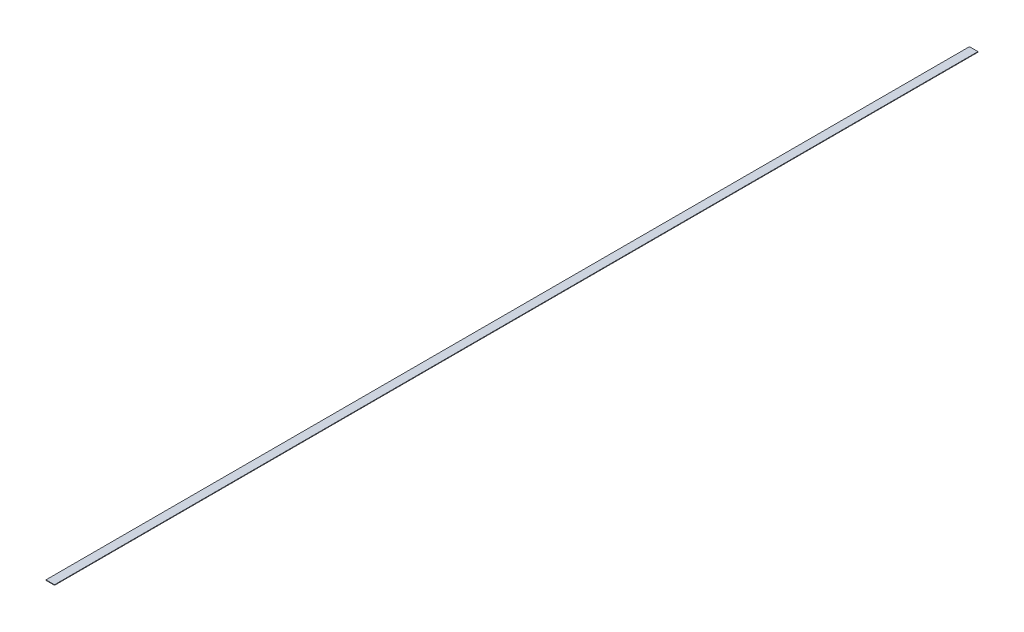
ISO-10303-21;
HEADER;
FILE_DESCRIPTION(('STEP AP214'),'2;1');
FILE_NAME('part.step','',(''),(''),'','','');
FILE_SCHEMA(('AUTOMOTIVE_DESIGN { 1 0 10303 214 1 1 1 1 }'));
ENDSEC;
DATA;
#1=APPLICATION_CONTEXT('core data for automotive mechanical design processes');
#2=APPLICATION_PROTOCOL_DEFINITION('international standard','automotive_design',2000,#1);
#3=PRODUCT_CONTEXT('',#1,'mechanical');
#4=PRODUCT('Part','Part','',(#3));
#5=PRODUCT_RELATED_PRODUCT_CATEGORY('part','',(#4));
#6=PRODUCT_DEFINITION_FORMATION('','',#4);
#7=PRODUCT_DEFINITION_CONTEXT('part definition',#1,'design');
#8=PRODUCT_DEFINITION('design','',#6,#7);
#9=PRODUCT_DEFINITION_SHAPE('','',#8);
#10=(LENGTH_UNIT() NAMED_UNIT(*) SI_UNIT(.MILLI.,.METRE.));
#11=(NAMED_UNIT(*) PLANE_ANGLE_UNIT() SI_UNIT($,.RADIAN.));
#12=(NAMED_UNIT(*) SI_UNIT($,.STERADIAN.) SOLID_ANGLE_UNIT());
#13=UNCERTAINTY_MEASURE_WITH_UNIT(LENGTH_MEASURE(1.E-05),#10,'distance_accuracy_value','');
#14=(GEOMETRIC_REPRESENTATION_CONTEXT(3) GLOBAL_UNCERTAINTY_ASSIGNED_CONTEXT((#13)) GLOBAL_UNIT_ASSIGNED_CONTEXT((#10,
#11,#12)) REPRESENTATION_CONTEXT('',''));
#15=CARTESIAN_POINT('',(0.,0.,0.));
#16=DIRECTION('',(0.,0.,1.));
#17=DIRECTION('',(1.,0.,0.));
#18=AXIS2_PLACEMENT_3D('',#15,#16,#17);
#19=CARTESIAN_POINT('',(25.4,3.175,2746.375));
#20=DIRECTION('',(-1.,0.,0.));
#21=DIRECTION('',(0.,0.,1.));
#22=AXIS2_PLACEMENT_3D('',#19,#20,#21);
#23=PLANE('',#22);
#24=DIRECTION('',(0.,0.,-1.));
#25=VECTOR('',#24,1.);
#26=CARTESIAN_POINT('',(25.4,0.,2746.375));
#27=LINE('',#26,#25);
#28=CARTESIAN_POINT('',(25.4,0.,2746.375));
#29=VERTEX_POINT('',#28);
#30=CARTESIAN_POINT('',(25.4,0.,-2746.375));
#31=VERTEX_POINT('',#30);
#32=EDGE_CURVE('E96',#29,#31,#27,.T.);
#33=ORIENTED_EDGE('',*,*,#32,.T.);
#34=DIRECTION('',(0.,-1.,0.));
#35=VECTOR('',#34,1.);
#36=CARTESIAN_POINT('',(25.4,3.175,-2746.375));
#37=LINE('',#36,#35);
#38=CARTESIAN_POINT('',(25.4,3.175,-2746.375));
#39=VERTEX_POINT('',#38);
#40=EDGE_CURVE('E11',#39,#31,#37,.T.);
#41=ORIENTED_EDGE('',*,*,#40,.F.);
#42=DIRECTION('',(0.,0.,-1.));
#43=VECTOR('',#42,1.);
#44=CARTESIAN_POINT('',(25.4,3.175,2746.375));
#45=LINE('',#44,#43);
#46=CARTESIAN_POINT('',(25.4,3.175,2746.375));
#47=VERTEX_POINT('',#46);
#48=EDGE_CURVE('E84',#47,#39,#45,.T.);
#49=ORIENTED_EDGE('',*,*,#48,.F.);
#50=DIRECTION('',(0.,-1.,0.));
#51=VECTOR('',#50,1.);
#52=CARTESIAN_POINT('',(25.4,3.175,2746.375));
#53=LINE('',#52,#51);
#54=EDGE_CURVE('E92',#47,#29,#53,.T.);
#55=ORIENTED_EDGE('',*,*,#54,.T.);
#56=EDGE_LOOP('',(#33,#41,#49,#55));
#57=FACE_BOUND('',#56,.T.);
#58=ADVANCED_FACE('F33',(#57),#23,.F.);
#59=CARTESIAN_POINT('',(-25.4,3.175,-2746.375));
#60=DIRECTION('',(0.,0.,1.));
#61=DIRECTION('',(1.,0.,0.));
#62=AXIS2_PLACEMENT_3D('',#59,#60,#61);
#63=PLANE('',#62);
#64=DIRECTION('',(-1.,0.,0.));
#65=VECTOR('',#64,1.);
#66=CARTESIAN_POINT('',(-25.4,0.,-2746.375));
#67=LINE('',#66,#65);
#68=CARTESIAN_POINT('',(-25.4,0.,-2746.375));
#69=VERTEX_POINT('',#68);
#70=EDGE_CURVE('E88',#31,#69,#67,.T.);
#71=ORIENTED_EDGE('',*,*,#70,.T.);
#72=DIRECTION('',(0.,-1.,0.));
#73=VECTOR('',#72,1.);
#74=CARTESIAN_POINT('',(-25.4,3.175,-2746.375));
#75=LINE('',#74,#73);
#76=CARTESIAN_POINT('',(-25.4,3.175,-2746.375));
#77=VERTEX_POINT('',#76);
#78=EDGE_CURVE('E41',#77,#69,#75,.T.);
#79=ORIENTED_EDGE('',*,*,#78,.F.);
#80=DIRECTION('',(-1.,0.,0.));
#81=VECTOR('',#80,1.);
#82=CARTESIAN_POINT('',(-25.4,3.175,-2746.375));
#83=LINE('',#82,#81);
#84=EDGE_CURVE('E79',#39,#77,#83,.T.);
#85=ORIENTED_EDGE('',*,*,#84,.F.);
#86=ORIENTED_EDGE('',*,*,#40,.T.);
#87=EDGE_LOOP('',(#71,#79,#85,#86));
#88=FACE_BOUND('',#87,.T.);
#89=ADVANCED_FACE('F87',(#88),#63,.F.);
#90=CARTESIAN_POINT('',(-25.4,3.175,2746.375));
#91=DIRECTION('',(1.,0.,0.));
#92=DIRECTION('',(0.,0.,-1.));
#93=AXIS2_PLACEMENT_3D('',#90,#91,#92);
#94=PLANE('',#93);
#95=DIRECTION('',(0.,0.,1.));
#96=VECTOR('',#95,1.);
#97=CARTESIAN_POINT('',(-25.4,0.,2746.375));
#98=LINE('',#97,#96);
#99=CARTESIAN_POINT('',(-25.4,0.,2746.375));
#100=VERTEX_POINT('',#99);
#101=EDGE_CURVE('E66',#69,#100,#98,.T.);
#102=ORIENTED_EDGE('',*,*,#101,.T.);
#103=DIRECTION('',(0.,-1.,0.));
#104=VECTOR('',#103,1.);
#105=CARTESIAN_POINT('',(-25.4,3.175,2746.375));
#106=LINE('',#105,#104);
#107=CARTESIAN_POINT('',(-25.4,3.175,2746.375));
#108=VERTEX_POINT('',#107);
#109=EDGE_CURVE('E89',#108,#100,#106,.T.);
#110=ORIENTED_EDGE('',*,*,#109,.F.);
#111=DIRECTION('',(0.,0.,1.));
#112=VECTOR('',#111,1.);
#113=CARTESIAN_POINT('',(-25.4,3.175,2746.375));
#114=LINE('',#113,#112);
#115=EDGE_CURVE('E82',#77,#108,#114,.T.);
#116=ORIENTED_EDGE('',*,*,#115,.F.);
#117=ORIENTED_EDGE('',*,*,#78,.T.);
#118=EDGE_LOOP('',(#102,#110,#116,#117));
#119=FACE_BOUND('',#118,.T.);
#120=ADVANCED_FACE('F90',(#119),#94,.F.);
#121=CARTESIAN_POINT('',(-25.4,3.175,2746.375));
#122=DIRECTION('',(0.,0.,-1.));
#123=DIRECTION('',(-1.,0.,0.));
#124=AXIS2_PLACEMENT_3D('',#121,#122,#123);
#125=PLANE('',#124);
#126=DIRECTION('',(1.,0.,0.));
#127=VECTOR('',#126,1.);
#128=CARTESIAN_POINT('',(-25.4,0.,2746.375));
#129=LINE('',#128,#127);
#130=EDGE_CURVE('E72',#100,#29,#129,.T.);
#131=ORIENTED_EDGE('',*,*,#130,.T.);
#132=ORIENTED_EDGE('',*,*,#54,.F.);
#133=DIRECTION('',(1.,0.,0.));
#134=VECTOR('',#133,1.);
#135=CARTESIAN_POINT('',(-25.4,3.175,2746.375));
#136=LINE('',#135,#134);
#137=EDGE_CURVE('E49',#108,#47,#136,.T.);
#138=ORIENTED_EDGE('',*,*,#137,.F.);
#139=ORIENTED_EDGE('',*,*,#109,.T.);
#140=EDGE_LOOP('',(#131,#132,#138,#139));
#141=FACE_BOUND('',#140,.T.);
#142=ADVANCED_FACE('F103',(#141),#125,.F.);
#143=CARTESIAN_POINT('',(0.,3.175,0.));
#144=DIRECTION('',(0.,-1.,0.));
#145=DIRECTION('',(0.,0.,-1.));
#146=AXIS2_PLACEMENT_3D('',#143,#144,#145);
#147=PLANE('',#146);
#148=ORIENTED_EDGE('',*,*,#48,.T.);
#149=ORIENTED_EDGE('',*,*,#84,.T.);
#150=ORIENTED_EDGE('',*,*,#115,.T.);
#151=ORIENTED_EDGE('',*,*,#137,.T.);
#152=EDGE_LOOP('',(#148,#149,#150,#151));
#153=FACE_BOUND('',#152,.T.);
#154=ADVANCED_FACE('F80',(#153),#147,.F.);
#155=CARTESIAN_POINT('',(0.,0.,0.));
#156=DIRECTION('',(0.,-1.,0.));
#157=DIRECTION('',(0.,0.,-1.));
#158=AXIS2_PLACEMENT_3D('',#155,#156,#157);
#159=PLANE('',#158);
#160=ORIENTED_EDGE('',*,*,#32,.F.);
#161=ORIENTED_EDGE('',*,*,#130,.F.);
#162=ORIENTED_EDGE('',*,*,#101,.F.);
#163=ORIENTED_EDGE('',*,*,#70,.F.);
#164=EDGE_LOOP('',(#160,#161,#162,#163));
#165=FACE_BOUND('',#164,.T.);
#166=ADVANCED_FACE('F106',(#165),#159,.T.);
#167=CLOSED_SHELL('',(#58,#89,#120,#142,#154,#166));
#168=MANIFOLD_SOLID_BREP('B2',#167);
#169=ADVANCED_BREP_SHAPE_REPRESENTATION('',(#18,#168),#14);
#170=SHAPE_DEFINITION_REPRESENTATION(#9,#169);
ENDSEC;
END-ISO-10303-21;
